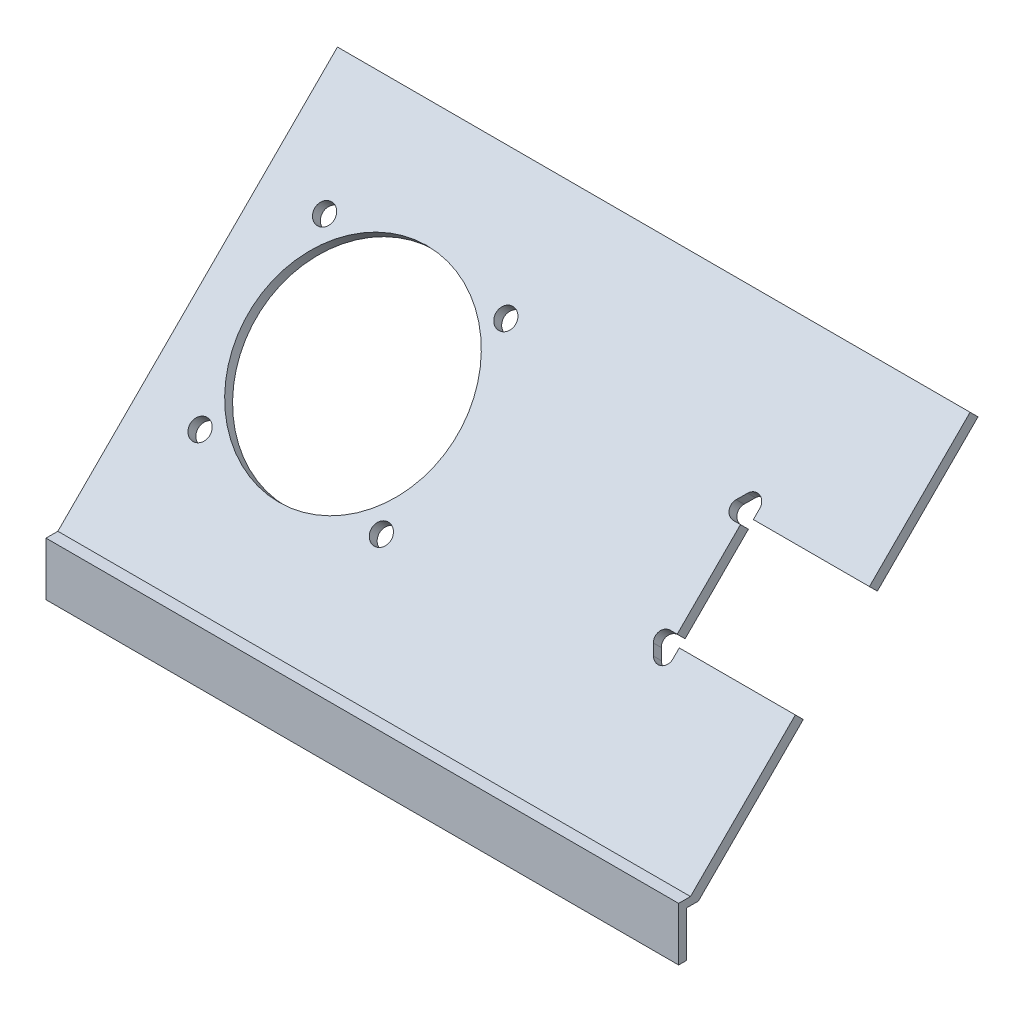
ISO-10303-21;
HEADER;
FILE_DESCRIPTION(('STEP AP214'),'2;1');
FILE_NAME('part.step','',(''),(''),'','','');
FILE_SCHEMA(('AUTOMOTIVE_DESIGN { 1 0 10303 214 1 1 1 1 }'));
ENDSEC;
DATA;
#1=APPLICATION_CONTEXT('core data for automotive mechanical design processes');
#2=APPLICATION_PROTOCOL_DEFINITION('international standard','automotive_design',2000,#1);
#3=PRODUCT_CONTEXT('',#1,'mechanical');
#4=PRODUCT('Part','Part','',(#3));
#5=PRODUCT_RELATED_PRODUCT_CATEGORY('part','',(#4));
#6=PRODUCT_DEFINITION_FORMATION('','',#4);
#7=PRODUCT_DEFINITION_CONTEXT('part definition',#1,'design');
#8=PRODUCT_DEFINITION('design','',#6,#7);
#9=PRODUCT_DEFINITION_SHAPE('','',#8);
#10=(LENGTH_UNIT() NAMED_UNIT(*) SI_UNIT(.MILLI.,.METRE.));
#11=(NAMED_UNIT(*) PLANE_ANGLE_UNIT() SI_UNIT($,.RADIAN.));
#12=(NAMED_UNIT(*) SI_UNIT($,.STERADIAN.) SOLID_ANGLE_UNIT());
#13=UNCERTAINTY_MEASURE_WITH_UNIT(LENGTH_MEASURE(1.E-05),#10,'distance_accuracy_value','');
#14=(GEOMETRIC_REPRESENTATION_CONTEXT(3) GLOBAL_UNCERTAINTY_ASSIGNED_CONTEXT((#13)) GLOBAL_UNIT_ASSIGNED_CONTEXT((#10,
#11,#12)) REPRESENTATION_CONTEXT('',''));
#15=CARTESIAN_POINT('',(0.,0.,0.));
#16=DIRECTION('',(0.,0.,1.));
#17=DIRECTION('',(1.,0.,0.));
#18=AXIS2_PLACEMENT_3D('',#15,#16,#17);
#19=CARTESIAN_POINT('',(160.,6.25,6.25));
#20=DIRECTION('',(0.,0.707106781186548,0.707106781186548));
#21=DIRECTION('',(0.,-0.707106781186548,0.707106781186548));
#22=AXIS2_PLACEMENT_3D('',#19,#20,#21);
#23=PLANE('',#22);
#24=CARTESIAN_POINT('',(61.6736181202223,65.1304255541661,-52.6304255541661));
#25=DIRECTION('',(0.,0.707106781186548,0.707106781186547));
#26=DIRECTION('',(0.,-0.707106781186547,0.707106781186548));
#27=AXIS2_PLACEMENT_3D('',#24,#25,#26);
#28=CIRCLE('',#27,2.5);
#29=CARTESIAN_POINT('',(61.6736181202223,63.3626586011997,-50.8626586011997));
#30=VERTEX_POINT('',#29);
#31=EDGE_CURVE('E768',#30,#30,#28,.F.);
#32=ORIENTED_EDGE('',*,*,#31,.T.);
#33=EDGE_LOOP('',(#32));
#34=FACE_BOUND('',#33,.T.);
#35=CARTESIAN_POINT('',(15.8263818797777,65.1304255541661,-52.6304255541661));
#36=DIRECTION('',(0.,0.707106781186548,0.707106781186547));
#37=DIRECTION('',(0.,-0.707106781186547,0.707106781186548));
#38=AXIS2_PLACEMENT_3D('',#35,#36,#37);
#39=CIRCLE('',#38,2.5);
#40=CARTESIAN_POINT('',(15.8263818797777,63.3626586011997,-50.8626586011997));
#41=VERTEX_POINT('',#40);
#42=EDGE_CURVE('E401',#41,#41,#39,.T.);
#43=ORIENTED_EDGE('',*,*,#42,.F.);
#44=EDGE_LOOP('',(#43));
#45=FACE_BOUND('',#44,.T.);
#46=CARTESIAN_POINT('',(38.75,49.3856691452173,-36.8856691452173));
#47=DIRECTION('',(0.,0.707106781186548,0.707106781186547));
#48=DIRECTION('',(0.,-0.707106781186547,0.707106781186548));
#49=AXIS2_PLACEMENT_3D('',#46,#47,#48);
#50=CIRCLE('',#49,26.5);
#51=CARTESIAN_POINT('',(38.75,30.6473394437738,-18.1473394437738));
#52=VERTEX_POINT('',#51);
#53=EDGE_CURVE('E256',#52,#52,#50,.T.);
#54=ORIENTED_EDGE('',*,*,#53,.F.);
#55=EDGE_LOOP('',(#54));
#56=FACE_BOUND('',#55,.T.);
#57=CARTESIAN_POINT('',(128.445858598964,60.3777556678548,-47.8777556678548));
#58=DIRECTION('',(0.,0.707106781186548,0.707106781186547));
#59=DIRECTION('',(0.,-0.707106781186547,0.707106781186548));
#60=AXIS2_PLACEMENT_3D('',#57,#58,#59);
#61=CIRCLE('',#60,2.19816547357507);
#62=CARTESIAN_POINT('',(130.64402407254,60.3777556678548,-47.8777556678547));
#63=VERTEX_POINT('',#62);
#64=CARTESIAN_POINT('',(126.663600689186,61.2875600952594,-48.7875600952594));
#65=VERTEX_POINT('',#64);
#66=EDGE_CURVE('E241',#63,#65,#61,.T.);
#67=ORIENTED_EDGE('',*,*,#66,.F.);
#68=DIRECTION('',(0.,-0.707106781186547,0.707106781186548));
#69=VECTOR('',#68,1.);
#70=CARTESIAN_POINT('',(130.64402407254,6.25000000000123,6.2499999999988));
#71=LINE('',#70,#69);
#72=CARTESIAN_POINT('',(130.644024072539,58.754833995939,-46.254833995939));
#73=VERTEX_POINT('',#72);
#74=EDGE_CURVE('E231',#63,#73,#71,.T.);
#75=ORIENTED_EDGE('',*,*,#74,.T.);
#76=DIRECTION('',(1.,0.,0.));
#77=VECTOR('',#76,1.);
#78=CARTESIAN_POINT('',(0.,58.754833995939,-46.254833995939));
#79=LINE('',#78,#77);
#80=CARTESIAN_POINT('',(160.,58.754833995939,-46.254833995939));
#81=VERTEX_POINT('',#80);
#82=EDGE_CURVE('E294',#73,#81,#79,.T.);
#83=ORIENTED_EDGE('',*,*,#82,.T.);
#84=DIRECTION('',(0.,0.707106781186548,-0.707106781186548));
#85=VECTOR('',#84,1.);
#86=CARTESIAN_POINT('',(160.,6.25,6.25));
#87=LINE('',#86,#85);
#88=CARTESIAN_POINT('',(160.,84.2106781186548,-71.7106781186547));
#89=VERTEX_POINT('',#88);
#90=EDGE_CURVE('E309',#81,#89,#87,.T.);
#91=ORIENTED_EDGE('',*,*,#90,.T.);
#92=DIRECTION('',(-1.,0.,0.));
#93=VECTOR('',#92,1.);
#94=CARTESIAN_POINT('',(160.,84.2106781186548,-71.7106781186547));
#95=LINE('',#94,#93);
#96=CARTESIAN_POINT('',(0.,84.2106781186548,-71.7106781186547));
#97=VERTEX_POINT('',#96);
#98=EDGE_CURVE('E329',#89,#97,#95,.T.);
#99=ORIENTED_EDGE('',*,*,#98,.T.);
#100=DIRECTION('',(0.,0.707106781186548,-0.707106781186548));
#101=VECTOR('',#100,1.);
#102=CARTESIAN_POINT('',(0.,6.25,6.25));
#103=LINE('',#102,#101);
#104=CARTESIAN_POINT('',(0.,13.5,-0.999999999999992));
#105=VERTEX_POINT('',#104);
#106=EDGE_CURVE('E321',#105,#97,#103,.T.);
#107=ORIENTED_EDGE('',*,*,#106,.F.);
#108=DIRECTION('',(-1.,0.,0.));
#109=VECTOR('',#108,1.);
#110=CARTESIAN_POINT('',(160.,13.5,-0.999999999999992));
#111=LINE('',#110,#109);
#112=CARTESIAN_POINT('',(160.,13.5,-0.999999999999992));
#113=VERTEX_POINT('',#112);
#114=EDGE_CURVE('E327',#113,#105,#111,.T.);
#115=ORIENTED_EDGE('',*,*,#114,.F.);
#116=CARTESIAN_POINT('',(160.,40.0165042944955,-27.5165042944955));
#117=VERTEX_POINT('',#116);
#118=EDGE_CURVE('E311',#113,#117,#87,.T.);
#119=ORIENTED_EDGE('',*,*,#118,.T.);
#120=DIRECTION('',(1.,0.,0.));
#121=VECTOR('',#120,1.);
#122=CARTESIAN_POINT('',(0.,40.0165042944955,-27.5165042944955));
#123=LINE('',#122,#121);
#124=CARTESIAN_POINT('',(130.644024072539,40.0165042944955,-27.5165042944955));
#125=VERTEX_POINT('',#124);
#126=EDGE_CURVE('E297',#125,#117,#123,.T.);
#127=ORIENTED_EDGE('',*,*,#126,.F.);
#128=DIRECTION('',(0.,0.707106781186547,-0.707106781186548));
#129=VECTOR('',#128,1.);
#130=CARTESIAN_POINT('',(130.644024072539,6.2499999999988,6.25000000000122));
#131=LINE('',#130,#129);
#132=CARTESIAN_POINT('',(130.644024072539,38.3935826225798,-25.8935826225798));
#133=VERTEX_POINT('',#132);
#134=EDGE_CURVE('E242',#133,#125,#131,.T.);
#135=ORIENTED_EDGE('',*,*,#134,.F.);
#136=CARTESIAN_POINT('',(128.445858598964,38.3935826225798,-25.8935826225798));
#137=DIRECTION('',(0.,0.707106781186548,0.707106781186547));
#138=DIRECTION('',(0.,-0.707106781186547,0.707106781186548));
#139=AXIS2_PLACEMENT_3D('',#136,#137,#138);
#140=CIRCLE('',#139,2.19816547357507);
#141=CARTESIAN_POINT('',(126.663600689186,37.4837781951753,-24.9837781951752));
#142=VERTEX_POINT('',#141);
#143=EDGE_CURVE('E267',#133,#142,#140,.F.);
#144=ORIENTED_EDGE('',*,*,#143,.T.);
#145=DIRECTION('',(0.585332531062842,-0.573317463574749,0.573317463574749));
#146=VECTOR('',#145,1.);
#147=CARTESIAN_POINT('',(104.22980368443,59.457078694574,-46.957078694574));
#148=LINE('',#147,#146);
#149=CARTESIAN_POINT('',(125.199975137255,38.9173600388708,-26.4173600388708));
#150=VERTEX_POINT('',#149);
#151=EDGE_CURVE('E277',#150,#142,#148,.T.);
#152=ORIENTED_EDGE('',*,*,#151,.F.);
#153=CARTESIAN_POINT('',(126.982233047034,39.8271644662754,-27.3271644662754));
#154=DIRECTION('',(0.,0.707106781186548,0.707106781186547));
#155=DIRECTION('',(0.,-0.707106781186547,0.707106781186548));
#156=AXIS2_PLACEMENT_3D('',#153,#154,#155);
#157=CIRCLE('',#156,2.19816547357505);
#158=CARTESIAN_POINT('',(126.982233047034,41.3815021788104,-28.8815021788104));
#159=VERTEX_POINT('',#158);
#160=EDGE_CURVE('E280',#150,#159,#157,.F.);
#161=ORIENTED_EDGE('',*,*,#160,.T.);
#162=DIRECTION('',(-1.,0.,0.));
#163=VECTOR('',#162,1.);
#164=CARTESIAN_POINT('',(0.,41.3815021788104,-28.8815021788104));
#165=LINE('',#164,#163);
#166=CARTESIAN_POINT('',(128.75,41.3815021788104,-28.8815021788104));
#167=VERTEX_POINT('',#166);
#168=EDGE_CURVE('E283',#167,#159,#165,.T.);
#169=ORIENTED_EDGE('',*,*,#168,.F.);
#170=DIRECTION('',(0.,0.707106781186547,-0.707106781186548));
#171=VECTOR('',#170,1.);
#172=CARTESIAN_POINT('',(128.75,6.25000000000001,6.25000000000001));
#173=LINE('',#172,#171);
#174=CARTESIAN_POINT('',(128.75,57.3898361116242,-44.8898361116242));
#175=VERTEX_POINT('',#174);
#176=EDGE_CURVE('E249',#167,#175,#173,.T.);
#177=ORIENTED_EDGE('',*,*,#176,.T.);
#178=DIRECTION('',(-1.,0.,0.));
#179=VECTOR('',#178,1.);
#180=CARTESIAN_POINT('',(0.,57.3898361116242,-44.8898361116242));
#181=LINE('',#180,#179);
#182=CARTESIAN_POINT('',(126.982233047034,57.3898361116242,-44.8898361116242));
#183=VERTEX_POINT('',#182);
#184=EDGE_CURVE('E90',#175,#183,#181,.T.);
#185=ORIENTED_EDGE('',*,*,#184,.T.);
#186=CARTESIAN_POINT('',(126.982233047034,58.9441738241592,-46.4441738241592));
#187=DIRECTION('',(0.,0.707106781186548,0.707106781186547));
#188=DIRECTION('',(0.,-0.707106781186547,0.707106781186548));
#189=AXIS2_PLACEMENT_3D('',#186,#187,#188);
#190=CIRCLE('',#189,2.19816547357505);
#191=CARTESIAN_POINT('',(125.199975137255,59.8539782515638,-47.3539782515638));
#192=VERTEX_POINT('',#191);
#193=EDGE_CURVE('E234',#192,#183,#190,.T.);
#194=ORIENTED_EDGE('',*,*,#193,.F.);
#195=DIRECTION('',(0.585332531062842,0.57331746357475,-0.573317463574748));
#196=VECTOR('',#195,1.);
#197=CARTESIAN_POINT('',(125.199975137255,59.8539782515638,-47.3539782515638));
#198=LINE('',#197,#196);
#199=EDGE_CURVE('E262',#192,#65,#198,.T.);
#200=ORIENTED_EDGE('',*,*,#199,.T.);
#201=EDGE_LOOP('',(#67,#75,#83,#91,#99,#107,#115,#119,#127,#135,#144,#152,#161,#169,#177,#185,
#194,#200));
#202=FACE_BOUND('',#201,.T.);
#203=CARTESIAN_POINT('',(61.6736181202223,33.6409127362686,-21.1409127362686));
#204=DIRECTION('',(0.,0.707106781186548,0.707106781186547));
#205=DIRECTION('',(0.,-0.707106781186547,0.707106781186548));
#206=AXIS2_PLACEMENT_3D('',#203,#204,#205);
#207=CIRCLE('',#206,2.49999999999999);
#208=CARTESIAN_POINT('',(61.6736181202223,31.8731457833022,-19.3731457833022));
#209=VERTEX_POINT('',#208);
#210=EDGE_CURVE('E765',#209,#209,#207,.T.);
#211=ORIENTED_EDGE('',*,*,#210,.F.);
#212=EDGE_LOOP('',(#211));
#213=FACE_BOUND('',#212,.T.);
#214=CARTESIAN_POINT('',(15.8263818797777,33.6409127362686,-21.1409127362686));
#215=DIRECTION('',(0.,0.707106781186548,0.707106781186547));
#216=DIRECTION('',(0.,-0.707106781186547,0.707106781186548));
#217=AXIS2_PLACEMENT_3D('',#214,#215,#216);
#218=CIRCLE('',#217,2.5);
#219=CARTESIAN_POINT('',(15.8263818797777,31.8731457833022,-19.3731457833022));
#220=VERTEX_POINT('',#219);
#221=EDGE_CURVE('E763',#220,#220,#218,.F.);
#222=ORIENTED_EDGE('',*,*,#221,.T.);
#223=EDGE_LOOP('',(#222));
#224=FACE_BOUND('',#223,.T.);
#225=ADVANCED_FACE('F73',(#34,#45,#56,#202,#213,#224),#23,.T.);
#226=CARTESIAN_POINT('',(160.,4.24999999999998,4.25));
#227=DIRECTION('',(0.,0.707106781186546,0.707106781186549));
#228=DIRECTION('',(0.,-0.707106781186549,0.707106781186546));
#229=AXIS2_PLACEMENT_3D('',#226,#227,#228);
#230=PLANE('',#229);
#231=CARTESIAN_POINT('',(61.6736181202223,31.6409127362686,-23.1409127362685));
#232=DIRECTION('',(0.,0.707106781186546,0.707106781186549));
#233=DIRECTION('',(0.,-0.707106781186549,0.707106781186546));
#234=AXIS2_PLACEMENT_3D('',#231,#232,#233);
#235=CIRCLE('',#234,2.49999999999999);
#236=CARTESIAN_POINT('',(61.6736181202223,29.8731457833022,-21.3731457833022));
#237=VERTEX_POINT('',#236);
#238=EDGE_CURVE('E403',#237,#237,#235,.T.);
#239=ORIENTED_EDGE('',*,*,#238,.T.);
#240=EDGE_LOOP('',(#239));
#241=FACE_BOUND('',#240,.T.);
#242=CARTESIAN_POINT('',(15.8263818797777,63.1304255541661,-54.630425554166));
#243=DIRECTION('',(0.,0.707106781186546,0.707106781186549));
#244=DIRECTION('',(0.,-0.707106781186549,0.707106781186546));
#245=AXIS2_PLACEMENT_3D('',#242,#243,#244);
#246=CIRCLE('',#245,2.5);
#247=CARTESIAN_POINT('',(15.8263818797777,61.3626586011998,-52.8626586011996));
#248=VERTEX_POINT('',#247);
#249=EDGE_CURVE('E397',#248,#248,#246,.T.);
#250=ORIENTED_EDGE('',*,*,#249,.T.);
#251=EDGE_LOOP('',(#250));
#252=FACE_BOUND('',#251,.T.);
#253=CARTESIAN_POINT('',(38.75,47.3856691452174,-38.8856691452172));
#254=DIRECTION('',(0.,0.707106781186546,0.707106781186549));
#255=DIRECTION('',(0.,-0.707106781186549,0.707106781186546));
#256=AXIS2_PLACEMENT_3D('',#253,#254,#255);
#257=CIRCLE('',#256,26.5);
#258=CARTESIAN_POINT('',(38.75,28.6473394437738,-20.1473394437737));
#259=VERTEX_POINT('',#258);
#260=EDGE_CURVE('E274',#259,#259,#257,.T.);
#261=ORIENTED_EDGE('',*,*,#260,.T.);
#262=EDGE_LOOP('',(#261));
#263=FACE_BOUND('',#262,.T.);
#264=DIRECTION('',(0.,-0.707106781186549,0.707106781186546));
#265=VECTOR('',#264,1.);
#266=CARTESIAN_POINT('',(130.64402407254,4.24999999999971,4.25000000000027));
#267=LINE('',#266,#265);
#268=CARTESIAN_POINT('',(130.64402407254,58.3777556678548,-49.8777556678547));
#269=VERTEX_POINT('',#268);
#270=CARTESIAN_POINT('',(130.644024072539,56.7548339959391,-48.254833995939));
#271=VERTEX_POINT('',#270);
#272=EDGE_CURVE('E292',#269,#271,#267,.T.);
#273=ORIENTED_EDGE('',*,*,#272,.F.);
#274=CARTESIAN_POINT('',(128.445858598964,58.3777556678549,-49.8777556678547));
#275=DIRECTION('',(0.,0.707106781186546,0.707106781186549));
#276=DIRECTION('',(0.,-0.707106781186549,0.707106781186546));
#277=AXIS2_PLACEMENT_3D('',#274,#275,#276);
#278=CIRCLE('',#277,2.19816547357507);
#279=CARTESIAN_POINT('',(126.663600689186,59.2875600952594,-50.7875600952593));
#280=VERTEX_POINT('',#279);
#281=EDGE_CURVE('E12',#269,#280,#278,.T.);
#282=ORIENTED_EDGE('',*,*,#281,.T.);
#283=DIRECTION('',(0.585332531062842,0.57331746357475,-0.573317463574748));
#284=VECTOR('',#283,1.);
#285=CARTESIAN_POINT('',(101.145964771776,34.2937223633486,-25.7937223633485));
#286=LINE('',#285,#284);
#287=CARTESIAN_POINT('',(125.199975137255,57.8539782515639,-49.3539782515637));
#288=VERTEX_POINT('',#287);
#289=EDGE_CURVE('E82',#288,#280,#286,.T.);
#290=ORIENTED_EDGE('',*,*,#289,.F.);
#291=CARTESIAN_POINT('',(126.982233047034,56.9441738241593,-48.4441738241591));
#292=DIRECTION('',(0.,0.707106781186546,0.707106781186549));
#293=DIRECTION('',(0.,-0.707106781186549,0.707106781186546));
#294=AXIS2_PLACEMENT_3D('',#291,#292,#293);
#295=CIRCLE('',#294,2.19816547357505);
#296=CARTESIAN_POINT('',(126.982233047034,55.3898361116242,-46.8898361116241));
#297=VERTEX_POINT('',#296);
#298=EDGE_CURVE('E392',#288,#297,#295,.T.);
#299=ORIENTED_EDGE('',*,*,#298,.T.);
#300=DIRECTION('',(-1.,0.,0.));
#301=VECTOR('',#300,1.);
#302=CARTESIAN_POINT('',(160.,55.3898361116242,-46.8898361116241));
#303=LINE('',#302,#301);
#304=CARTESIAN_POINT('',(128.75,55.3898361116242,-46.8898361116241));
#305=VERTEX_POINT('',#304);
#306=EDGE_CURVE('E227',#305,#297,#303,.T.);
#307=ORIENTED_EDGE('',*,*,#306,.F.);
#308=DIRECTION('',(0.,0.707106781186549,-0.707106781186546));
#309=VECTOR('',#308,1.);
#310=CARTESIAN_POINT('',(128.75,4.24999999999998,4.25));
#311=LINE('',#310,#309);
#312=CARTESIAN_POINT('',(128.75,39.3815021788105,-30.8815021788104));
#313=VERTEX_POINT('',#312);
#314=EDGE_CURVE('E368',#313,#305,#311,.T.);
#315=ORIENTED_EDGE('',*,*,#314,.F.);
#316=DIRECTION('',(-1.,0.,0.));
#317=VECTOR('',#316,1.);
#318=CARTESIAN_POINT('',(160.,39.3815021788105,-30.8815021788104));
#319=LINE('',#318,#317);
#320=CARTESIAN_POINT('',(126.982233047034,39.3815021788105,-30.8815021788104));
#321=VERTEX_POINT('',#320);
#322=EDGE_CURVE('E98',#313,#321,#319,.T.);
#323=ORIENTED_EDGE('',*,*,#322,.T.);
#324=CARTESIAN_POINT('',(126.982233047034,37.8271644662754,-29.3271644662753));
#325=DIRECTION('',(0.,0.707106781186546,0.707106781186549));
#326=DIRECTION('',(0.,-0.707106781186549,0.707106781186546));
#327=AXIS2_PLACEMENT_3D('',#324,#325,#326);
#328=CIRCLE('',#327,2.19816547357505);
#329=CARTESIAN_POINT('',(125.199975137255,36.9173600388708,-28.4173600388707));
#330=VERTEX_POINT('',#329);
#331=EDGE_CURVE('E385',#330,#321,#328,.F.);
#332=ORIENTED_EDGE('',*,*,#331,.F.);
#333=DIRECTION('',(0.585332531062842,-0.57331746357475,0.573317463574748));
#334=VECTOR('',#333,1.);
#335=CARTESIAN_POINT('',(159.048071191699,3.76406076549617,4.73593923450381));
#336=LINE('',#335,#334);
#337=CARTESIAN_POINT('',(126.663600689186,35.4837781951753,-26.9837781951752));
#338=VERTEX_POINT('',#337);
#339=EDGE_CURVE('E387',#330,#338,#336,.T.);
#340=ORIENTED_EDGE('',*,*,#339,.T.);
#341=CARTESIAN_POINT('',(128.445858598964,36.3935826225798,-27.8935826225798));
#342=DIRECTION('',(0.,0.707106781186546,0.707106781186549));
#343=DIRECTION('',(0.,-0.707106781186549,0.707106781186546));
#344=AXIS2_PLACEMENT_3D('',#341,#342,#343);
#345=CIRCLE('',#344,2.19816547357507);
#346=CARTESIAN_POINT('',(130.644024072539,36.3935826225798,-27.8935826225798));
#347=VERTEX_POINT('',#346);
#348=EDGE_CURVE('E390',#347,#338,#345,.F.);
#349=ORIENTED_EDGE('',*,*,#348,.F.);
#350=DIRECTION('',(0.,0.707106781186549,-0.707106781186546));
#351=VECTOR('',#350,1.);
#352=CARTESIAN_POINT('',(130.644024072539,4.25000000000025,4.24999999999972));
#353=LINE('',#352,#351);
#354=CARTESIAN_POINT('',(130.644024072539,38.0165042944956,-29.5165042944955));
#355=VERTEX_POINT('',#354);
#356=EDGE_CURVE('E289',#347,#355,#353,.T.);
#357=ORIENTED_EDGE('',*,*,#356,.T.);
#358=DIRECTION('',(1.,0.,0.));
#359=VECTOR('',#358,1.);
#360=CARTESIAN_POINT('',(160.,38.0165042944956,-29.5165042944955));
#361=LINE('',#360,#359);
#362=CARTESIAN_POINT('',(160.,38.0165042944956,-29.5165042944955));
#363=VERTEX_POINT('',#362);
#364=EDGE_CURVE('E371',#355,#363,#361,.T.);
#365=ORIENTED_EDGE('',*,*,#364,.T.);
#366=DIRECTION('',(0.,0.707106781186549,-0.707106781186546));
#367=VECTOR('',#366,1.);
#368=CARTESIAN_POINT('',(160.,4.24999999999998,4.25));
#369=LINE('',#368,#367);
#370=CARTESIAN_POINT('',(160.,11.5,-3.));
#371=VERTEX_POINT('',#370);
#372=EDGE_CURVE('E315',#371,#363,#369,.T.);
#373=ORIENTED_EDGE('',*,*,#372,.F.);
#374=DIRECTION('',(-1.,0.,0.));
#375=VECTOR('',#374,1.);
#376=CARTESIAN_POINT('',(160.,11.5,-3.));
#377=LINE('',#376,#375);
#378=CARTESIAN_POINT('',(0.,11.5,-3.));
#379=VERTEX_POINT('',#378);
#380=EDGE_CURVE('E359',#371,#379,#377,.T.);
#381=ORIENTED_EDGE('',*,*,#380,.T.);
#382=DIRECTION('',(0.,0.707106781186549,-0.707106781186546));
#383=VECTOR('',#382,1.);
#384=CARTESIAN_POINT('',(0.,4.24999999999998,4.25));
#385=LINE('',#384,#383);
#386=CARTESIAN_POINT('',(0.,82.2106781186548,-73.7106781186547));
#387=VERTEX_POINT('',#386);
#388=EDGE_CURVE('E310',#379,#387,#385,.T.);
#389=ORIENTED_EDGE('',*,*,#388,.T.);
#390=DIRECTION('',(-1.,0.,0.));
#391=VECTOR('',#390,1.);
#392=CARTESIAN_POINT('',(160.,82.2106781186548,-73.7106781186547));
#393=LINE('',#392,#391);
#394=CARTESIAN_POINT('',(160.,82.2106781186548,-73.7106781186547));
#395=VERTEX_POINT('',#394);
#396=EDGE_CURVE('E318',#395,#387,#393,.T.);
#397=ORIENTED_EDGE('',*,*,#396,.F.);
#398=CARTESIAN_POINT('',(160.,56.7548339959391,-48.254833995939));
#399=VERTEX_POINT('',#398);
#400=EDGE_CURVE('E314',#399,#395,#369,.T.);
#401=ORIENTED_EDGE('',*,*,#400,.F.);
#402=DIRECTION('',(1.,0.,0.));
#403=VECTOR('',#402,1.);
#404=CARTESIAN_POINT('',(160.,56.7548339959391,-48.254833995939));
#405=LINE('',#404,#403);
#406=EDGE_CURVE('E373',#271,#399,#405,.T.);
#407=ORIENTED_EDGE('',*,*,#406,.F.);
#408=EDGE_LOOP('',(#273,#282,#290,#299,#307,#315,#323,#332,#340,#349,#357,#365,#373,#381,#389,
#397,#401,#407));
#409=FACE_BOUND('',#408,.T.);
#410=CARTESIAN_POINT('',(61.6736181202223,63.1304255541661,-54.630425554166));
#411=DIRECTION('',(0.,0.707106781186546,0.707106781186549));
#412=DIRECTION('',(0.,-0.707106781186549,0.707106781186546));
#413=AXIS2_PLACEMENT_3D('',#410,#411,#412);
#414=CIRCLE('',#413,2.5);
#415=CARTESIAN_POINT('',(61.6736181202223,61.3626586011998,-52.8626586011996));
#416=VERTEX_POINT('',#415);
#417=EDGE_CURVE('E400',#416,#416,#414,.F.);
#418=ORIENTED_EDGE('',*,*,#417,.F.);
#419=EDGE_LOOP('',(#418));
#420=FACE_BOUND('',#419,.T.);
#421=CARTESIAN_POINT('',(15.8263818797777,31.6409127362686,-23.1409127362685));
#422=DIRECTION('',(0.,0.707106781186546,0.707106781186549));
#423=DIRECTION('',(0.,-0.707106781186549,0.707106781186546));
#424=AXIS2_PLACEMENT_3D('',#421,#422,#423);
#425=CIRCLE('',#424,2.5);
#426=CARTESIAN_POINT('',(15.8263818797777,29.8731457833022,-21.3731457833022));
#427=VERTEX_POINT('',#426);
#428=EDGE_CURVE('E77',#427,#427,#425,.F.);
#429=ORIENTED_EDGE('',*,*,#428,.F.);
#430=EDGE_LOOP('',(#429));
#431=FACE_BOUND('',#430,.T.);
#432=ADVANCED_FACE('F417',(#241,#252,#263,#409,#420,#431),#230,.F.);
#433=CARTESIAN_POINT('',(0.,51.6837661840736,-53.3259018078045));
#434=DIRECTION('',(0.,-0.707106781186547,0.707106781186548));
#435=DIRECTION('',(0.,-0.707106781186548,-0.707106781186547));
#436=AXIS2_PLACEMENT_3D('',#433,#434,#435);
#437=PLANE('',#436);
#438=ORIENTED_EDGE('',*,*,#82,.F.);
#439=DIRECTION('',(0.,-0.707106781186548,-0.707106781186547));
#440=VECTOR('',#439,1.);
#441=CARTESIAN_POINT('',(130.644024072539,51.6837661840736,-53.3259018078045));
#442=LINE('',#441,#440);
#443=EDGE_CURVE('E382',#73,#271,#442,.T.);
#444=ORIENTED_EDGE('',*,*,#443,.T.);
#445=ORIENTED_EDGE('',*,*,#406,.T.);
#446=DIRECTION('',(0.,0.707106781186548,0.707106781186547));
#447=VECTOR('',#446,1.);
#448=CARTESIAN_POINT('',(160.,51.6837661840736,-53.3259018078045));
#449=LINE('',#448,#447);
#450=EDGE_CURVE('E300',#399,#81,#449,.T.);
#451=ORIENTED_EDGE('',*,*,#450,.T.);
#452=EDGE_LOOP('',(#438,#444,#445,#451));
#453=FACE_BOUND('',#452,.T.);
#454=ADVANCED_FACE('F424',(#453),#437,.T.);
#455=CARTESIAN_POINT('',(128.75,-0.821067811865463,-0.821067811865464));
#456=DIRECTION('',(1.,0.,0.));
#457=DIRECTION('',(0.,0.,-1.));
#458=AXIS2_PLACEMENT_3D('',#455,#456,#457);
#459=PLANE('',#458);
#460=ORIENTED_EDGE('',*,*,#314,.T.);
#461=DIRECTION('',(0.,0.707106781186548,0.707106781186547));
#462=VECTOR('',#461,1.);
#463=CARTESIAN_POINT('',(128.75,50.3187682997587,-51.9609039234896));
#464=LINE('',#463,#462);
#465=EDGE_CURVE('E377',#305,#175,#464,.T.);
#466=ORIENTED_EDGE('',*,*,#465,.T.);
#467=ORIENTED_EDGE('',*,*,#176,.F.);
#468=DIRECTION('',(0.,0.707106781186548,0.707106781186547));
#469=VECTOR('',#468,1.);
#470=CARTESIAN_POINT('',(128.75,34.3104343669449,-35.9525699906759));
#471=LINE('',#470,#469);
#472=EDGE_CURVE('E375',#313,#167,#471,.T.);
#473=ORIENTED_EDGE('',*,*,#472,.F.);
#474=EDGE_LOOP('',(#460,#466,#467,#473));
#475=FACE_BOUND('',#474,.T.);
#476=ADVANCED_FACE('F539',(#475),#459,.T.);
#477=CARTESIAN_POINT('',(160.,0.,0.));
#478=DIRECTION('',(1.,0.,0.));
#479=DIRECTION('',(0.,0.,-1.));
#480=AXIS2_PLACEMENT_3D('',#477,#478,#479);
#481=PLANE('',#480);
#482=ORIENTED_EDGE('',*,*,#90,.F.);
#483=ORIENTED_EDGE('',*,*,#450,.F.);
#484=ORIENTED_EDGE('',*,*,#400,.T.);
#485=DIRECTION('',(0.,-0.707106781186545,-0.70710678118655));
#486=VECTOR('',#485,1.);
#487=CARTESIAN_POINT('',(160.,77.960678118655,-77.9606781186545));
#488=LINE('',#487,#486);
#489=EDGE_CURVE('E306',#89,#395,#488,.T.);
#490=ORIENTED_EDGE('',*,*,#489,.F.);
#491=EDGE_LOOP('',(#482,#483,#484,#490));
#492=FACE_BOUND('',#491,.T.);
#493=ADVANCED_FACE('F441',(#492),#481,.T.);
#494=CARTESIAN_POINT('',(160.,0.,0.));
#495=DIRECTION('',(0.,1.,0.));
#496=DIRECTION('',(0.,0.,1.));
#497=AXIS2_PLACEMENT_3D('',#494,#495,#496);
#498=PLANE('',#497);
#499=DIRECTION('',(0.,0.,-1.));
#500=VECTOR('',#499,1.);
#501=CARTESIAN_POINT('',(0.,0.,0.));
#502=LINE('',#501,#500);
#503=CARTESIAN_POINT('',(0.,0.,2.));
#504=VERTEX_POINT('',#503);
#505=CARTESIAN_POINT('',(0.,0.,0.));
#506=VERTEX_POINT('',#505);
#507=EDGE_CURVE('E331',#504,#506,#502,.T.);
#508=ORIENTED_EDGE('',*,*,#507,.T.);
#509=DIRECTION('',(-1.,0.,0.));
#510=VECTOR('',#509,1.);
#511=CARTESIAN_POINT('',(160.,0.,0.));
#512=LINE('',#511,#510);
#513=CARTESIAN_POINT('',(160.,0.,0.));
#514=VERTEX_POINT('',#513);
#515=EDGE_CURVE('E365',#514,#506,#512,.T.);
#516=ORIENTED_EDGE('',*,*,#515,.F.);
#517=DIRECTION('',(0.,0.,-1.));
#518=VECTOR('',#517,1.);
#519=CARTESIAN_POINT('',(160.,0.,0.));
#520=LINE('',#519,#518);
#521=CARTESIAN_POINT('',(160.,0.,2.));
#522=VERTEX_POINT('',#521);
#523=EDGE_CURVE('E332',#522,#514,#520,.T.);
#524=ORIENTED_EDGE('',*,*,#523,.F.);
#525=DIRECTION('',(-1.,0.,0.));
#526=VECTOR('',#525,1.);
#527=CARTESIAN_POINT('',(160.,0.,2.));
#528=LINE('',#527,#526);
#529=EDGE_CURVE('E344',#522,#504,#528,.T.);
#530=ORIENTED_EDGE('',*,*,#529,.T.);
#531=EDGE_LOOP('',(#508,#516,#524,#530));
#532=FACE_BOUND('',#531,.T.);
#533=ADVANCED_FACE('F75',(#532),#498,.F.);
#534=CARTESIAN_POINT('',(160.,0.,0.));
#535=DIRECTION('',(0.,0.,1.));
#536=DIRECTION('',(1.,0.,0.));
#537=AXIS2_PLACEMENT_3D('',#534,#535,#536);
#538=PLANE('',#537);
#539=DIRECTION('',(0.,1.,0.));
#540=VECTOR('',#539,1.);
#541=CARTESIAN_POINT('',(0.,0.,0.));
#542=LINE('',#541,#540);
#543=CARTESIAN_POINT('',(0.,11.5,0.));
#544=VERTEX_POINT('',#543);
#545=EDGE_CURVE('E347',#506,#544,#542,.T.);
#546=ORIENTED_EDGE('',*,*,#545,.T.);
#547=DIRECTION('',(-1.,0.,0.));
#548=VECTOR('',#547,1.);
#549=CARTESIAN_POINT('',(160.,11.5,0.));
#550=LINE('',#549,#548);
#551=CARTESIAN_POINT('',(160.,11.5,0.));
#552=VERTEX_POINT('',#551);
#553=EDGE_CURVE('E362',#552,#544,#550,.T.);
#554=ORIENTED_EDGE('',*,*,#553,.F.);
#555=DIRECTION('',(0.,1.,0.));
#556=VECTOR('',#555,1.);
#557=CARTESIAN_POINT('',(160.,0.,0.));
#558=LINE('',#557,#556);
#559=EDGE_CURVE('E335',#514,#552,#558,.T.);
#560=ORIENTED_EDGE('',*,*,#559,.F.);
#561=ORIENTED_EDGE('',*,*,#515,.T.);
#562=EDGE_LOOP('',(#546,#554,#560,#561));
#563=FACE_BOUND('',#562,.T.);
#564=ADVANCED_FACE('F454',(#563),#538,.F.);
#565=CARTESIAN_POINT('',(160.,11.5,0.));
#566=DIRECTION('',(0.,1.,0.));
#567=DIRECTION('',(0.,0.,1.));
#568=AXIS2_PLACEMENT_3D('',#565,#566,#567);
#569=PLANE('',#568);
#570=DIRECTION('',(0.,0.,-1.));
#571=VECTOR('',#570,1.);
#572=CARTESIAN_POINT('',(0.,11.5,0.));
#573=LINE('',#572,#571);
#574=EDGE_CURVE('E349',#544,#379,#573,.T.);
#575=ORIENTED_EDGE('',*,*,#574,.T.);
#576=ORIENTED_EDGE('',*,*,#380,.F.);
#577=DIRECTION('',(0.,0.,-1.));
#578=VECTOR('',#577,1.);
#579=CARTESIAN_POINT('',(160.,11.5,0.));
#580=LINE('',#579,#578);
#581=EDGE_CURVE('E338',#552,#371,#580,.T.);
#582=ORIENTED_EDGE('',*,*,#581,.F.);
#583=ORIENTED_EDGE('',*,*,#553,.T.);
#584=EDGE_LOOP('',(#575,#576,#582,#583));
#585=FACE_BOUND('',#584,.T.);
#586=ADVANCED_FACE('F451',(#585),#569,.F.);
#587=CARTESIAN_POINT('',(160.,13.5,-3.));
#588=DIRECTION('',(0.,-1.,0.));
#589=DIRECTION('',(0.,0.,-1.));
#590=AXIS2_PLACEMENT_3D('',#587,#588,#589);
#591=PLANE('',#590);
#592=DIRECTION('',(0.,0.,1.));
#593=VECTOR('',#592,1.);
#594=CARTESIAN_POINT('',(160.,13.5,-3.));
#595=LINE('',#594,#593);
#596=CARTESIAN_POINT('',(160.,13.5,2.));
#597=VERTEX_POINT('',#596);
#598=EDGE_CURVE('E340',#113,#597,#595,.T.);
#599=ORIENTED_EDGE('',*,*,#598,.F.);
#600=ORIENTED_EDGE('',*,*,#114,.T.);
#601=DIRECTION('',(0.,0.,1.));
#602=VECTOR('',#601,1.);
#603=CARTESIAN_POINT('',(0.,13.5,-3.));
#604=LINE('',#603,#602);
#605=CARTESIAN_POINT('',(0.,13.5,2.));
#606=VERTEX_POINT('',#605);
#607=EDGE_CURVE('E351',#105,#606,#604,.T.);
#608=ORIENTED_EDGE('',*,*,#607,.T.);
#609=DIRECTION('',(-1.,0.,0.));
#610=VECTOR('',#609,1.);
#611=CARTESIAN_POINT('',(160.,13.5,2.));
#612=LINE('',#611,#610);
#613=EDGE_CURVE('E356',#597,#606,#612,.T.);
#614=ORIENTED_EDGE('',*,*,#613,.F.);
#615=EDGE_LOOP('',(#599,#600,#608,#614));
#616=FACE_BOUND('',#615,.T.);
#617=ADVANCED_FACE('F447',(#616),#591,.F.);
#618=CARTESIAN_POINT('',(160.,13.5,2.));
#619=DIRECTION('',(0.,0.,-1.));
#620=DIRECTION('',(-1.,0.,0.));
#621=AXIS2_PLACEMENT_3D('',#618,#619,#620);
#622=PLANE('',#621);
#623=DIRECTION('',(0.,-1.,0.));
#624=VECTOR('',#623,1.);
#625=CARTESIAN_POINT('',(0.,13.5,2.));
#626=LINE('',#625,#624);
#627=EDGE_CURVE('E336',#606,#504,#626,.T.);
#628=ORIENTED_EDGE('',*,*,#627,.T.);
#629=ORIENTED_EDGE('',*,*,#529,.F.);
#630=DIRECTION('',(0.,-1.,0.));
#631=VECTOR('',#630,1.);
#632=CARTESIAN_POINT('',(160.,13.5,2.));
#633=LINE('',#632,#631);
#634=EDGE_CURVE('E342',#597,#522,#633,.T.);
#635=ORIENTED_EDGE('',*,*,#634,.F.);
#636=ORIENTED_EDGE('',*,*,#613,.T.);
#637=EDGE_LOOP('',(#628,#629,#635,#636));
#638=FACE_BOUND('',#637,.T.);
#639=ADVANCED_FACE('F439',(#638),#622,.F.);
#640=DIRECTION('',(0.,0.707106781186548,0.707106781186547));
#641=VECTOR('',#640,1.);
#642=CARTESIAN_POINT('',(160.,32.9454364826301,-34.587572106361));
#643=LINE('',#642,#641);
#644=EDGE_CURVE('E299',#363,#117,#643,.T.);
#645=ORIENTED_EDGE('',*,*,#644,.T.);
#646=ORIENTED_EDGE('',*,*,#118,.F.);
#647=ORIENTED_EDGE('',*,*,#598,.T.);
#648=ORIENTED_EDGE('',*,*,#634,.T.);
#649=ORIENTED_EDGE('',*,*,#523,.T.);
#650=ORIENTED_EDGE('',*,*,#559,.T.);
#651=ORIENTED_EDGE('',*,*,#581,.T.);
#652=ORIENTED_EDGE('',*,*,#372,.T.);
#653=EDGE_LOOP('',(#645,#646,#647,#648,#649,#650,#651,#652));
#654=FACE_BOUND('',#653,.T.);
#655=ADVANCED_FACE('F436',(#654),#481,.T.);
#656=CARTESIAN_POINT('',(0.,0.,0.));
#657=DIRECTION('',(1.,0.,0.));
#658=DIRECTION('',(0.,0.,-1.));
#659=AXIS2_PLACEMENT_3D('',#656,#657,#658);
#660=PLANE('',#659);
#661=ORIENTED_EDGE('',*,*,#607,.F.);
#662=ORIENTED_EDGE('',*,*,#106,.T.);
#663=DIRECTION('',(0.,-0.707106781186545,-0.70710678118655));
#664=VECTOR('',#663,1.);
#665=CARTESIAN_POINT('',(0.,77.960678118655,-77.9606781186545));
#666=LINE('',#665,#664);
#667=EDGE_CURVE('E303',#97,#387,#666,.T.);
#668=ORIENTED_EDGE('',*,*,#667,.T.);
#669=ORIENTED_EDGE('',*,*,#388,.F.);
#670=ORIENTED_EDGE('',*,*,#574,.F.);
#671=ORIENTED_EDGE('',*,*,#545,.F.);
#672=ORIENTED_EDGE('',*,*,#507,.F.);
#673=ORIENTED_EDGE('',*,*,#627,.F.);
#674=EDGE_LOOP('',(#661,#662,#668,#669,#670,#671,#672,#673));
#675=FACE_BOUND('',#674,.T.);
#676=ADVANCED_FACE('F434',(#675),#660,.F.);
#677=CARTESIAN_POINT('',(160.,77.960678118655,-77.9606781186545));
#678=DIRECTION('',(0.,0.70710678118655,-0.707106781186545));
#679=DIRECTION('',(0.,0.707106781186545,0.70710678118655));
#680=AXIS2_PLACEMENT_3D('',#677,#678,#679);
#681=PLANE('',#680);
#682=ORIENTED_EDGE('',*,*,#667,.F.);
#683=ORIENTED_EDGE('',*,*,#98,.F.);
#684=ORIENTED_EDGE('',*,*,#489,.T.);
#685=ORIENTED_EDGE('',*,*,#396,.T.);
#686=EDGE_LOOP('',(#682,#683,#684,#685));
#687=FACE_BOUND('',#686,.T.);
#688=ADVANCED_FACE('F430',(#687),#681,.T.);
#689=CARTESIAN_POINT('',(0.,32.9454364826301,-34.587572106361));
#690=DIRECTION('',(0.,-0.707106781186547,0.707106781186548));
#691=DIRECTION('',(0.,-0.707106781186548,-0.707106781186547));
#692=AXIS2_PLACEMENT_3D('',#689,#690,#691);
#693=PLANE('',#692);
#694=ORIENTED_EDGE('',*,*,#364,.F.);
#695=DIRECTION('',(0.,0.707106781186548,0.707106781186547));
#696=VECTOR('',#695,1.);
#697=CARTESIAN_POINT('',(130.644024072539,32.9454364826301,-34.587572106361));
#698=LINE('',#697,#696);
#699=EDGE_CURVE('E379',#355,#125,#698,.T.);
#700=ORIENTED_EDGE('',*,*,#699,.T.);
#701=ORIENTED_EDGE('',*,*,#126,.T.);
#702=ORIENTED_EDGE('',*,*,#644,.F.);
#703=EDGE_LOOP('',(#694,#700,#701,#702));
#704=FACE_BOUND('',#703,.T.);
#705=ADVANCED_FACE('F433',(#704),#693,.F.);
#706=CARTESIAN_POINT('',(128.445858598964,31.3225148107143,-32.9646504344453));
#707=DIRECTION('',(0.,0.707106781186548,0.707106781186547));
#708=DIRECTION('',(0.,-0.707106781186547,0.707106781186548));
#709=AXIS2_PLACEMENT_3D('',#706,#707,#708);
#710=CYLINDRICAL_SURFACE('',#709,2.19816547357507);
#711=ORIENTED_EDGE('',*,*,#348,.T.);
#712=DIRECTION('',(0.,0.707106781186548,0.707106781186547));
#713=VECTOR('',#712,1.);
#714=CARTESIAN_POINT('',(126.663600689186,30.4127103833098,-32.0548460070407));
#715=LINE('',#714,#713);
#716=EDGE_CURVE('E270',#338,#142,#715,.T.);
#717=ORIENTED_EDGE('',*,*,#716,.T.);
#718=ORIENTED_EDGE('',*,*,#143,.F.);
#719=DIRECTION('',(0.,0.707106781186548,0.707106781186547));
#720=VECTOR('',#719,1.);
#721=CARTESIAN_POINT('',(130.644024072539,31.3225148107143,-32.9646504344453));
#722=LINE('',#721,#720);
#723=EDGE_CURVE('E272',#347,#133,#722,.T.);
#724=ORIENTED_EDGE('',*,*,#723,.F.);
#725=EDGE_LOOP('',(#711,#717,#718,#724));
#726=FACE_BOUND('',#725,.T.);
#727=ADVANCED_FACE('F531',(#726),#710,.F.);
#728=CARTESIAN_POINT('',(104.22980368443,52.3860108827085,-54.0281465064395));
#729=DIRECTION('',(-0.810793332532753,-0.413892601963621,0.413892601963621));
#730=DIRECTION('',(0.454664295958135,0.,0.890662886832551));
#731=AXIS2_PLACEMENT_3D('',#728,#729,#730);
#732=PLANE('',#731);
#733=DIRECTION('',(0.,0.707106781186548,0.707106781186547));
#734=VECTOR('',#733,1.);
#735=CARTESIAN_POINT('',(125.199975137255,31.8462922270053,-33.4884278507363));
#736=LINE('',#735,#734);
#737=EDGE_CURVE('E268',#330,#150,#736,.T.);
#738=ORIENTED_EDGE('',*,*,#737,.T.);
#739=ORIENTED_EDGE('',*,*,#151,.T.);
#740=ORIENTED_EDGE('',*,*,#716,.F.);
#741=ORIENTED_EDGE('',*,*,#339,.F.);
#742=EDGE_LOOP('',(#738,#739,#740,#741));
#743=FACE_BOUND('',#742,.T.);
#744=ADVANCED_FACE('F527',(#743),#732,.F.);
#745=CARTESIAN_POINT('',(126.982233047034,32.7560966544099,-34.3982322781409));
#746=DIRECTION('',(0.,0.707106781186548,0.707106781186547));
#747=DIRECTION('',(0.,-0.707106781186547,0.707106781186548));
#748=AXIS2_PLACEMENT_3D('',#745,#746,#747);
#749=CYLINDRICAL_SURFACE('',#748,2.19816547357505);
#750=ORIENTED_EDGE('',*,*,#331,.T.);
#751=DIRECTION('',(0.,0.707106781186548,0.707106781186547));
#752=VECTOR('',#751,1.);
#753=CARTESIAN_POINT('',(126.982233047034,34.310434366945,-35.9525699906759));
#754=LINE('',#753,#752);
#755=EDGE_CURVE('E265',#321,#159,#754,.T.);
#756=ORIENTED_EDGE('',*,*,#755,.T.);
#757=ORIENTED_EDGE('',*,*,#160,.F.);
#758=ORIENTED_EDGE('',*,*,#737,.F.);
#759=EDGE_LOOP('',(#750,#756,#757,#758));
#760=FACE_BOUND('',#759,.T.);
#761=ADVANCED_FACE('F522',(#760),#749,.F.);
#762=CARTESIAN_POINT('',(130.644024072539,-0.821067811866676,-0.82106781186425));
#763=DIRECTION('',(1.,0.,0.));
#764=DIRECTION('',(0.,0.,-1.));
#765=AXIS2_PLACEMENT_3D('',#762,#763,#764);
#766=PLANE('',#765);
#767=ORIENTED_EDGE('',*,*,#723,.T.);
#768=ORIENTED_EDGE('',*,*,#134,.T.);
#769=ORIENTED_EDGE('',*,*,#699,.F.);
#770=ORIENTED_EDGE('',*,*,#356,.F.);
#771=EDGE_LOOP('',(#767,#768,#769,#770));
#772=FACE_BOUND('',#771,.T.);
#773=ADVANCED_FACE('F514',(#772),#766,.F.);
#774=CARTESIAN_POINT('',(0.,34.3104343669449,-35.9525699906759));
#775=DIRECTION('',(0.,0.707106781186547,-0.707106781186548));
#776=DIRECTION('',(0.,0.707106781186548,0.707106781186547));
#777=AXIS2_PLACEMENT_3D('',#774,#775,#776);
#778=PLANE('',#777);
#779=ORIENTED_EDGE('',*,*,#472,.T.);
#780=ORIENTED_EDGE('',*,*,#168,.T.);
#781=ORIENTED_EDGE('',*,*,#755,.F.);
#782=ORIENTED_EDGE('',*,*,#322,.F.);
#783=EDGE_LOOP('',(#779,#780,#781,#782));
#784=FACE_BOUND('',#783,.T.);
#785=ADVANCED_FACE('F507',(#784),#778,.F.);
#786=CARTESIAN_POINT('',(125.199975137255,52.7829104396983,-54.4250460634293));
#787=DIRECTION('',(0.810793332532753,-0.413892601963621,0.413892601963621));
#788=DIRECTION('',(0.454664295958136,0.,-0.89066288683255));
#789=AXIS2_PLACEMENT_3D('',#786,#787,#788);
#790=PLANE('',#789);
#791=ORIENTED_EDGE('',*,*,#289,.T.);
#792=DIRECTION('',(0.,0.707106781186548,0.707106781186547));
#793=VECTOR('',#792,1.);
#794=CARTESIAN_POINT('',(126.663600689186,54.2164922833939,-55.8586279071248));
#795=LINE('',#794,#793);
#796=EDGE_CURVE('E253',#280,#65,#795,.T.);
#797=ORIENTED_EDGE('',*,*,#796,.T.);
#798=ORIENTED_EDGE('',*,*,#199,.F.);
#799=DIRECTION('',(0.,0.707106781186548,0.707106781186547));
#800=VECTOR('',#799,1.);
#801=CARTESIAN_POINT('',(125.199975137255,52.7829104396983,-54.4250460634293));
#802=LINE('',#801,#800);
#803=EDGE_CURVE('E237',#288,#192,#802,.T.);
#804=ORIENTED_EDGE('',*,*,#803,.F.);
#805=EDGE_LOOP('',(#791,#797,#798,#804));
#806=FACE_BOUND('',#805,.T.);
#807=ADVANCED_FACE('F505',(#806),#790,.T.);
#808=CARTESIAN_POINT('',(128.445858598964,53.3066878559893,-54.9488234797203));
#809=DIRECTION('',(0.,0.707106781186548,0.707106781186547));
#810=DIRECTION('',(0.,-0.707106781186547,0.707106781186548));
#811=AXIS2_PLACEMENT_3D('',#808,#809,#810);
#812=CYLINDRICAL_SURFACE('',#811,2.19816547357507);
#813=DIRECTION('',(0.,0.707106781186548,0.707106781186547));
#814=VECTOR('',#813,1.);
#815=CARTESIAN_POINT('',(130.64402407254,53.3066878559893,-54.9488234797202));
#816=LINE('',#815,#814);
#817=EDGE_CURVE('E230',#269,#63,#816,.T.);
#818=ORIENTED_EDGE('',*,*,#817,.T.);
#819=ORIENTED_EDGE('',*,*,#66,.T.);
#820=ORIENTED_EDGE('',*,*,#796,.F.);
#821=ORIENTED_EDGE('',*,*,#281,.F.);
#822=EDGE_LOOP('',(#818,#819,#820,#821));
#823=FACE_BOUND('',#822,.T.);
#824=ADVANCED_FACE('F502',(#823),#812,.F.);
#825=CARTESIAN_POINT('',(126.982233047034,51.8731060122937,-53.5152416360247));
#826=DIRECTION('',(0.,0.707106781186548,0.707106781186547));
#827=DIRECTION('',(0.,-0.707106781186547,0.707106781186548));
#828=AXIS2_PLACEMENT_3D('',#825,#826,#827);
#829=CYLINDRICAL_SURFACE('',#828,2.19816547357505);
#830=ORIENTED_EDGE('',*,*,#803,.T.);
#831=ORIENTED_EDGE('',*,*,#193,.T.);
#832=DIRECTION('',(0.,0.707106781186548,0.707106781186547));
#833=VECTOR('',#832,1.);
#834=CARTESIAN_POINT('',(126.982233047034,50.3187682997587,-51.9609039234896));
#835=LINE('',#834,#833);
#836=EDGE_CURVE('E223',#297,#183,#835,.T.);
#837=ORIENTED_EDGE('',*,*,#836,.F.);
#838=ORIENTED_EDGE('',*,*,#298,.F.);
#839=EDGE_LOOP('',(#830,#831,#837,#838));
#840=FACE_BOUND('',#839,.T.);
#841=ADVANCED_FACE('F235',(#840),#829,.F.);
#842=CARTESIAN_POINT('',(130.64402407254,-0.821067811864249,-0.821067811866677));
#843=DIRECTION('',(-1.,0.,0.));
#844=DIRECTION('',(0.,0.,1.));
#845=AXIS2_PLACEMENT_3D('',#842,#843,#844);
#846=PLANE('',#845);
#847=ORIENTED_EDGE('',*,*,#272,.T.);
#848=ORIENTED_EDGE('',*,*,#443,.F.);
#849=ORIENTED_EDGE('',*,*,#74,.F.);
#850=ORIENTED_EDGE('',*,*,#817,.F.);
#851=EDGE_LOOP('',(#847,#848,#849,#850));
#852=FACE_BOUND('',#851,.T.);
#853=ADVANCED_FACE('F498',(#852),#846,.T.);
#854=CARTESIAN_POINT('',(0.,50.3187682997587,-51.9609039234896));
#855=DIRECTION('',(0.,0.707106781186547,-0.707106781186548));
#856=DIRECTION('',(0.,0.707106781186548,0.707106781186547));
#857=AXIS2_PLACEMENT_3D('',#854,#855,#856);
#858=PLANE('',#857);
#859=ORIENTED_EDGE('',*,*,#306,.T.);
#860=ORIENTED_EDGE('',*,*,#836,.T.);
#861=ORIENTED_EDGE('',*,*,#184,.F.);
#862=ORIENTED_EDGE('',*,*,#465,.F.);
#863=EDGE_LOOP('',(#859,#860,#861,#862));
#864=FACE_BOUND('',#863,.T.);
#865=ADVANCED_FACE('F225',(#864),#858,.T.);
#866=CARTESIAN_POINT('',(38.75,42.3146013333518,-43.9567369570828));
#867=DIRECTION('',(0.,0.707106781186548,0.707106781186547));
#868=DIRECTION('',(0.,-0.707106781186547,0.707106781186548));
#869=AXIS2_PLACEMENT_3D('',#866,#867,#868);
#870=CYLINDRICAL_SURFACE('',#869,26.5);
#871=ORIENTED_EDGE('',*,*,#53,.T.);
#872=EDGE_LOOP('',(#871));
#873=FACE_BOUND('',#872,.T.);
#874=ORIENTED_EDGE('',*,*,#260,.F.);
#875=EDGE_LOOP('',(#874));
#876=FACE_BOUND('',#875,.T.);
#877=ADVANCED_FACE('F413',(#873,#876),#870,.F.);
#878=CARTESIAN_POINT('',(15.8263818797777,58.0593577423006,-59.7014933660315));
#879=DIRECTION('',(0.,0.707106781186548,0.707106781186547));
#880=DIRECTION('',(0.,-0.707106781186547,0.707106781186548));
#881=AXIS2_PLACEMENT_3D('',#878,#879,#880);
#882=CYLINDRICAL_SURFACE('',#881,2.5);
#883=ORIENTED_EDGE('',*,*,#42,.T.);
#884=EDGE_LOOP('',(#883));
#885=FACE_BOUND('',#884,.T.);
#886=ORIENTED_EDGE('',*,*,#249,.F.);
#887=EDGE_LOOP('',(#886));
#888=FACE_BOUND('',#887,.T.);
#889=ADVANCED_FACE('F613',(#885,#888),#882,.F.);
#890=CARTESIAN_POINT('',(61.6736181202223,58.0593577423006,-59.7014933660315));
#891=DIRECTION('',(0.,0.707106781186548,0.707106781186547));
#892=DIRECTION('',(0.,-0.707106781186547,0.707106781186548));
#893=AXIS2_PLACEMENT_3D('',#890,#891,#892);
#894=CYLINDRICAL_SURFACE('',#893,2.5);
#895=ORIENTED_EDGE('',*,*,#31,.F.);
#896=EDGE_LOOP('',(#895));
#897=FACE_BOUND('',#896,.T.);
#898=ORIENTED_EDGE('',*,*,#417,.T.);
#899=EDGE_LOOP('',(#898));
#900=FACE_BOUND('',#899,.T.);
#901=ADVANCED_FACE('F623',(#897,#900),#894,.F.);
#902=CARTESIAN_POINT('',(61.6736181202223,26.5698449244031,-28.211980548134));
#903=DIRECTION('',(0.,0.707106781186548,0.707106781186547));
#904=DIRECTION('',(0.,-0.707106781186547,0.707106781186548));
#905=AXIS2_PLACEMENT_3D('',#902,#903,#904);
#906=CYLINDRICAL_SURFACE('',#905,2.49999999999999);
#907=ORIENTED_EDGE('',*,*,#210,.T.);
#908=EDGE_LOOP('',(#907));
#909=FACE_BOUND('',#908,.T.);
#910=ORIENTED_EDGE('',*,*,#238,.F.);
#911=EDGE_LOOP('',(#910));
#912=FACE_BOUND('',#911,.T.);
#913=ADVANCED_FACE('F631',(#909,#912),#906,.F.);
#914=CARTESIAN_POINT('',(15.8263818797777,26.5698449244031,-28.211980548134));
#915=DIRECTION('',(0.,0.707106781186548,0.707106781186547));
#916=DIRECTION('',(0.,-0.707106781186547,0.707106781186548));
#917=AXIS2_PLACEMENT_3D('',#914,#915,#916);
#918=CYLINDRICAL_SURFACE('',#917,2.5);
#919=ORIENTED_EDGE('',*,*,#221,.F.);
#920=EDGE_LOOP('',(#919));
#921=FACE_BOUND('',#920,.T.);
#922=ORIENTED_EDGE('',*,*,#428,.T.);
#923=EDGE_LOOP('',(#922));
#924=FACE_BOUND('',#923,.T.);
#925=ADVANCED_FACE('F639',(#921,#924),#918,.F.);
#926=CLOSED_SHELL('',(#225,#432,#454,#476,#493,#533,#564,#586,#617,#639,#655,#676,#688,#705,
#727,#744,#761,#773,#785,#807,#824,#841,#853,#865,#877,#889,#901,#913,#925));
#927=MANIFOLD_SOLID_BREP('B2',#926);
#928=ADVANCED_BREP_SHAPE_REPRESENTATION('',(#18,#927),#14);
#929=SHAPE_DEFINITION_REPRESENTATION(#9,#928);
ENDSEC;
END-ISO-10303-21;
